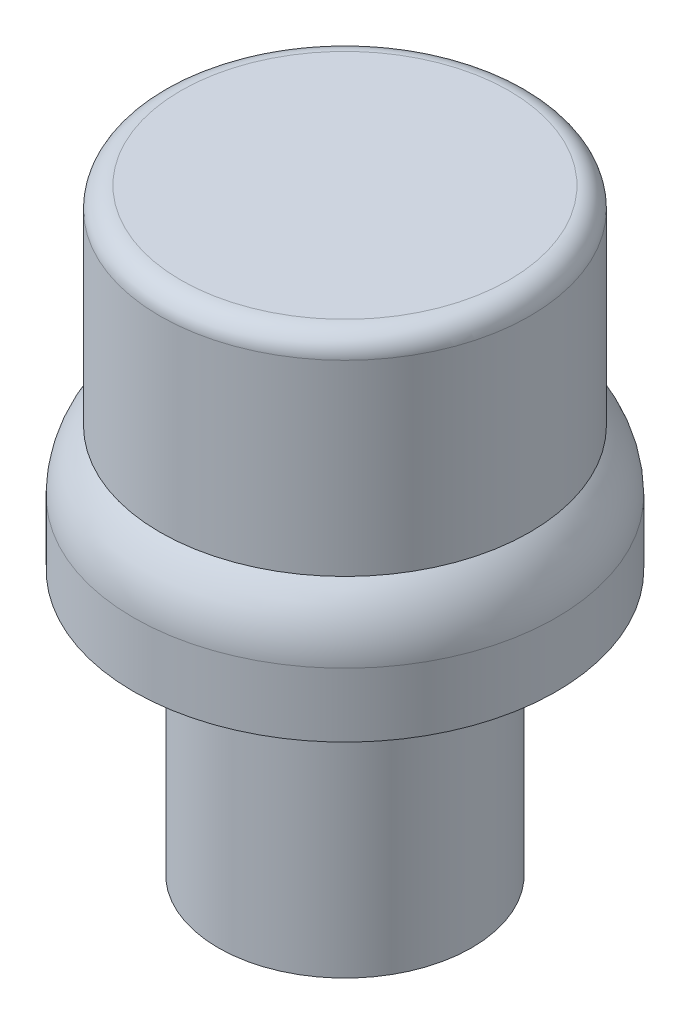
ISO-10303-21;
HEADER;
FILE_DESCRIPTION(('STEP AP214'),'2;1');
FILE_NAME('part.step','',(''),(''),'','','');
FILE_SCHEMA(('AUTOMOTIVE_DESIGN { 1 0 10303 214 1 1 1 1 }'));
ENDSEC;
DATA;
#1=APPLICATION_CONTEXT('core data for automotive mechanical design processes');
#2=APPLICATION_PROTOCOL_DEFINITION('international standard','automotive_design',2000,#1);
#3=PRODUCT_CONTEXT('',#1,'mechanical');
#4=PRODUCT('Part','Part','',(#3));
#5=PRODUCT_RELATED_PRODUCT_CATEGORY('part','',(#4));
#6=PRODUCT_DEFINITION_FORMATION('','',#4);
#7=PRODUCT_DEFINITION_CONTEXT('part definition',#1,'design');
#8=PRODUCT_DEFINITION('design','',#6,#7);
#9=PRODUCT_DEFINITION_SHAPE('','',#8);
#10=(LENGTH_UNIT() NAMED_UNIT(*) SI_UNIT(.MILLI.,.METRE.));
#11=(NAMED_UNIT(*) PLANE_ANGLE_UNIT() SI_UNIT($,.RADIAN.));
#12=(NAMED_UNIT(*) SI_UNIT($,.STERADIAN.) SOLID_ANGLE_UNIT());
#13=UNCERTAINTY_MEASURE_WITH_UNIT(LENGTH_MEASURE(1.E-05),#10,'distance_accuracy_value','');
#14=(GEOMETRIC_REPRESENTATION_CONTEXT(3) GLOBAL_UNCERTAINTY_ASSIGNED_CONTEXT((#13)) GLOBAL_UNIT_ASSIGNED_CONTEXT((#10,
#11,#12)) REPRESENTATION_CONTEXT('',''));
#15=CARTESIAN_POINT('',(0.,0.,0.));
#16=DIRECTION('',(0.,0.,1.));
#17=DIRECTION('',(1.,0.,0.));
#18=AXIS2_PLACEMENT_3D('',#15,#16,#17);
#19=CARTESIAN_POINT('',(0.,3.,0.));
#20=DIRECTION('',(0.,-1.,0.));
#21=DIRECTION('',(0.,0.,-1.));
#22=AXIS2_PLACEMENT_3D('',#19,#20,#21);
#23=CYLINDRICAL_SURFACE('',#22,5.08);
#24=CARTESIAN_POINT('',(0.,1.5382288140752,0.));
#25=DIRECTION('',(0.,1.,0.));
#26=DIRECTION('',(0.,0.,1.));
#27=AXIS2_PLACEMENT_3D('',#24,#25,#26);
#28=CIRCLE('',#27,5.08);
#29=CARTESIAN_POINT('',(0.,1.5382288140752,5.08));
#30=VERTEX_POINT('',#29);
#31=EDGE_CURVE('E119',#30,#30,#28,.F.);
#32=ORIENTED_EDGE('',*,*,#31,.T.);
#33=EDGE_LOOP('',(#32));
#34=FACE_BOUND('',#33,.T.);
#35=CARTESIAN_POINT('',(0.,0.,0.));
#36=DIRECTION('',(0.,1.,0.));
#37=DIRECTION('',(0.,0.,1.));
#38=AXIS2_PLACEMENT_3D('',#35,#36,#37);
#39=CIRCLE('',#38,5.08);
#40=CARTESIAN_POINT('',(0.,0.,5.08));
#41=VERTEX_POINT('',#40);
#42=EDGE_CURVE('E114',#41,#41,#39,.T.);
#43=ORIENTED_EDGE('',*,*,#42,.T.);
#44=EDGE_LOOP('',(#43));
#45=FACE_BOUND('',#44,.T.);
#46=ADVANCED_FACE('F33',(#34,#45),#23,.T.);
#47=CARTESIAN_POINT('',(0.,0.,0.));
#48=DIRECTION('',(0.,1.,0.));
#49=DIRECTION('',(0.,0.,1.));
#50=AXIS2_PLACEMENT_3D('',#47,#48,#49);
#51=PLANE('',#50);
#52=CARTESIAN_POINT('',(0.,0.,0.));
#53=DIRECTION('',(0.,-1.,0.));
#54=DIRECTION('',(0.,0.,-1.));
#55=AXIS2_PLACEMENT_3D('',#52,#53,#54);
#56=CIRCLE('',#55,3.048);
#57=CARTESIAN_POINT('',(0.,0.,-3.048));
#58=VERTEX_POINT('',#57);
#59=EDGE_CURVE('E11',#58,#58,#56,.T.);
#60=ORIENTED_EDGE('',*,*,#59,.F.);
#61=EDGE_LOOP('',(#60));
#62=FACE_BOUND('',#61,.T.);
#63=ORIENTED_EDGE('',*,*,#42,.F.);
#64=EDGE_LOOP('',(#63));
#65=FACE_BOUND('',#64,.T.);
#66=ADVANCED_FACE('F147',(#62,#65),#51,.F.);
#67=CARTESIAN_POINT('',(0.,8.,0.));
#68=DIRECTION('',(0.,-1.,0.));
#69=DIRECTION('',(0.,0.,-1.));
#70=AXIS2_PLACEMENT_3D('',#67,#68,#69);
#71=CYLINDRICAL_SURFACE('',#70,4.445);
#72=CARTESIAN_POINT('',(0.,7.5,0.));
#73=DIRECTION('',(0.,1.,0.));
#74=DIRECTION('',(0.,0.,1.));
#75=AXIS2_PLACEMENT_3D('',#72,#73,#74);
#76=CIRCLE('',#75,4.445);
#77=CARTESIAN_POINT('',(0.,7.5,4.445));
#78=VERTEX_POINT('',#77);
#79=EDGE_CURVE('E37',#78,#78,#76,.F.);
#80=ORIENTED_EDGE('',*,*,#79,.T.);
#81=EDGE_LOOP('',(#80));
#82=FACE_BOUND('',#81,.T.);
#83=CARTESIAN_POINT('',(0.,3.,0.));
#84=DIRECTION('',(0.,1.,0.));
#85=DIRECTION('',(0.,0.,1.));
#86=AXIS2_PLACEMENT_3D('',#83,#84,#85);
#87=CIRCLE('',#86,4.445);
#88=CARTESIAN_POINT('',(0.,3.,4.445));
#89=VERTEX_POINT('',#88);
#90=EDGE_CURVE('E116',#89,#89,#87,.T.);
#91=ORIENTED_EDGE('',*,*,#90,.T.);
#92=EDGE_LOOP('',(#91));
#93=FACE_BOUND('',#92,.T.);
#94=ADVANCED_FACE('F130',(#82,#93),#71,.T.);
#95=CARTESIAN_POINT('',(0.,8.,0.));
#96=DIRECTION('',(0.,1.,0.));
#97=DIRECTION('',(0.,0.,1.));
#98=AXIS2_PLACEMENT_3D('',#95,#96,#97);
#99=PLANE('',#98);
#100=CARTESIAN_POINT('',(0.,8.,0.));
#101=DIRECTION('',(0.,1.,0.));
#102=DIRECTION('',(0.,0.,1.));
#103=AXIS2_PLACEMENT_3D('',#100,#101,#102);
#104=CIRCLE('',#103,3.945);
#105=CARTESIAN_POINT('',(0.,8.,3.945));
#106=VERTEX_POINT('',#105);
#107=EDGE_CURVE('E123',#106,#106,#104,.T.);
#108=ORIENTED_EDGE('',*,*,#107,.T.);
#109=EDGE_LOOP('',(#108));
#110=FACE_BOUND('',#109,.T.);
#111=ADVANCED_FACE('F144',(#110),#99,.T.);
#112=CARTESIAN_POINT('',(0.,1.5382288140752,0.));
#113=DIRECTION('',(0.,1.,0.));
#114=DIRECTION('',(0.,0.,1.));
#115=AXIS2_PLACEMENT_3D('',#112,#113,#114);
#116=TOROIDAL_SURFACE('',#115,3.08,2.);
#117=ORIENTED_EDGE('',*,*,#31,.F.);
#118=EDGE_LOOP('',(#117));
#119=FACE_BOUND('',#118,.T.);
#120=ORIENTED_EDGE('',*,*,#90,.F.);
#121=EDGE_LOOP('',(#120));
#122=FACE_BOUND('',#121,.T.);
#123=ADVANCED_FACE('F136',(#119,#122),#116,.T.);
#124=CARTESIAN_POINT('',(0.,7.5,0.));
#125=DIRECTION('',(0.,1.,0.));
#126=DIRECTION('',(0.,0.,1.));
#127=AXIS2_PLACEMENT_3D('',#124,#125,#126);
#128=TOROIDAL_SURFACE('',#127,3.945,0.5);
#129=ORIENTED_EDGE('',*,*,#79,.F.);
#130=EDGE_LOOP('',(#129));
#131=FACE_BOUND('',#130,.T.);
#132=ORIENTED_EDGE('',*,*,#107,.F.);
#133=EDGE_LOOP('',(#132));
#134=FACE_BOUND('',#133,.T.);
#135=ADVANCED_FACE('F35',(#131,#134),#128,.T.);
#136=CARTESIAN_POINT('',(0.,-6.35,0.));
#137=DIRECTION('',(0.,1.,0.));
#138=DIRECTION('',(0.,0.,1.));
#139=AXIS2_PLACEMENT_3D('',#136,#137,#138);
#140=CYLINDRICAL_SURFACE('',#139,3.048);
#141=CARTESIAN_POINT('',(0.,-6.35,0.));
#142=DIRECTION('',(0.,-1.,0.));
#143=DIRECTION('',(0.,0.,-1.));
#144=AXIS2_PLACEMENT_3D('',#141,#142,#143);
#145=CIRCLE('',#144,3.048);
#146=CARTESIAN_POINT('',(0.,-6.35,-3.048));
#147=VERTEX_POINT('',#146);
#148=EDGE_CURVE('E110',#147,#147,#145,.T.);
#149=ORIENTED_EDGE('',*,*,#148,.F.);
#150=EDGE_LOOP('',(#149));
#151=FACE_BOUND('',#150,.T.);
#152=ORIENTED_EDGE('',*,*,#59,.T.);
#153=EDGE_LOOP('',(#152));
#154=FACE_BOUND('',#153,.T.);
#155=ADVANCED_FACE('F135',(#151,#154),#140,.T.);
#156=CARTESIAN_POINT('',(0.,-6.35,0.));
#157=DIRECTION('',(0.,-1.,0.));
#158=DIRECTION('',(0.,0.,-1.));
#159=AXIS2_PLACEMENT_3D('',#156,#157,#158);
#160=PLANE('',#159);
#161=DIRECTION('',(0.,0.,1.));
#162=VECTOR('',#161,1.);
#163=CARTESIAN_POINT('',(0.793692416751826,-6.35,-0.744956917477651));
#164=LINE('',#163,#162);
#165=CARTESIAN_POINT('',(0.793692416751826,-6.35,-0.744956917477651));
#166=VERTEX_POINT('',#165);
#167=CARTESIAN_POINT('',(0.793692416751826,-6.35,0.744956917477651));
#168=VERTEX_POINT('',#167);
#169=EDGE_CURVE('E49',#166,#168,#164,.T.);
#170=ORIENTED_EDGE('',*,*,#169,.F.);
#171=DIRECTION('',(1.,0.,0.));
#172=VECTOR('',#171,1.);
#173=CARTESIAN_POINT('',(-0.793692416751826,-6.35,-0.744956917477651));
#174=LINE('',#173,#172);
#175=CARTESIAN_POINT('',(-0.793692416751826,-6.35,-0.744956917477651));
#176=VERTEX_POINT('',#175);
#177=EDGE_CURVE('E100',#176,#166,#174,.T.);
#178=ORIENTED_EDGE('',*,*,#177,.F.);
#179=DIRECTION('',(0.,0.,-1.));
#180=VECTOR('',#179,1.);
#181=CARTESIAN_POINT('',(-0.793692416751826,-6.35,-0.744956917477651));
#182=LINE('',#181,#180);
#183=CARTESIAN_POINT('',(-0.793692416751826,-6.35,0.744956917477651));
#184=VERTEX_POINT('',#183);
#185=EDGE_CURVE('E106',#184,#176,#182,.T.);
#186=ORIENTED_EDGE('',*,*,#185,.F.);
#187=DIRECTION('',(-1.,0.,0.));
#188=VECTOR('',#187,1.);
#189=CARTESIAN_POINT('',(-0.793692416751826,-6.35,0.744956917477651));
#190=LINE('',#189,#188);
#191=EDGE_CURVE('E84',#168,#184,#190,.T.);
#192=ORIENTED_EDGE('',*,*,#191,.F.);
#193=EDGE_LOOP('',(#170,#178,#186,#192));
#194=FACE_BOUND('',#193,.T.);
#195=ORIENTED_EDGE('',*,*,#148,.T.);
#196=EDGE_LOOP('',(#195));
#197=FACE_BOUND('',#196,.T.);
#198=ADVANCED_FACE('F141',(#194,#197),#160,.T.);
#199=CARTESIAN_POINT('',(0.793692416751826,-5.08,-0.744956917477651));
#200=DIRECTION('',(1.,0.,0.));
#201=DIRECTION('',(0.,0.,-1.));
#202=AXIS2_PLACEMENT_3D('',#199,#200,#201);
#203=PLANE('',#202);
#204=ORIENTED_EDGE('',*,*,#169,.T.);
#205=DIRECTION('',(0.,-1.,0.));
#206=VECTOR('',#205,1.);
#207=CARTESIAN_POINT('',(0.793692416751826,-5.08,0.744956917477651));
#208=LINE('',#207,#206);
#209=CARTESIAN_POINT('',(0.793692416751826,-5.08,0.744956917477651));
#210=VERTEX_POINT('',#209);
#211=EDGE_CURVE('E72',#210,#168,#208,.T.);
#212=ORIENTED_EDGE('',*,*,#211,.F.);
#213=DIRECTION('',(0.,0.,1.));
#214=VECTOR('',#213,1.);
#215=CARTESIAN_POINT('',(0.793692416751826,-5.08,-0.744956917477651));
#216=LINE('',#215,#214);
#217=CARTESIAN_POINT('',(0.793692416751826,-5.08,-0.744956917477651));
#218=VERTEX_POINT('',#217);
#219=EDGE_CURVE('E98',#218,#210,#216,.T.);
#220=ORIENTED_EDGE('',*,*,#219,.F.);
#221=DIRECTION('',(0.,-1.,0.));
#222=VECTOR('',#221,1.);
#223=CARTESIAN_POINT('',(0.793692416751826,-5.08,-0.744956917477651));
#224=LINE('',#223,#222);
#225=EDGE_CURVE('E57',#218,#166,#224,.T.);
#226=ORIENTED_EDGE('',*,*,#225,.T.);
#227=EDGE_LOOP('',(#204,#212,#220,#226));
#228=FACE_BOUND('',#227,.T.);
#229=ADVANCED_FACE('F163',(#228),#203,.F.);
#230=CARTESIAN_POINT('',(-0.793692416751826,-5.08,-0.744956917477651));
#231=DIRECTION('',(0.,0.,-1.));
#232=DIRECTION('',(-1.,0.,0.));
#233=AXIS2_PLACEMENT_3D('',#230,#231,#232);
#234=PLANE('',#233);
#235=ORIENTED_EDGE('',*,*,#177,.T.);
#236=ORIENTED_EDGE('',*,*,#225,.F.);
#237=DIRECTION('',(1.,0.,0.));
#238=VECTOR('',#237,1.);
#239=CARTESIAN_POINT('',(-0.793692416751826,-5.08,-0.744956917477651));
#240=LINE('',#239,#238);
#241=CARTESIAN_POINT('',(-0.793692416751826,-5.08,-0.744956917477651));
#242=VERTEX_POINT('',#241);
#243=EDGE_CURVE('E95',#242,#218,#240,.T.);
#244=ORIENTED_EDGE('',*,*,#243,.F.);
#245=DIRECTION('',(0.,-1.,0.));
#246=VECTOR('',#245,1.);
#247=CARTESIAN_POINT('',(-0.793692416751826,-5.08,-0.744956917477651));
#248=LINE('',#247,#246);
#249=EDGE_CURVE('E88',#242,#176,#248,.T.);
#250=ORIENTED_EDGE('',*,*,#249,.T.);
#251=EDGE_LOOP('',(#235,#236,#244,#250));
#252=FACE_BOUND('',#251,.T.);
#253=ADVANCED_FACE('F167',(#252),#234,.F.);
#254=CARTESIAN_POINT('',(-0.793692416751826,-5.08,-0.744956917477651));
#255=DIRECTION('',(-1.,0.,0.));
#256=DIRECTION('',(0.,0.,1.));
#257=AXIS2_PLACEMENT_3D('',#254,#255,#256);
#258=PLANE('',#257);
#259=ORIENTED_EDGE('',*,*,#185,.T.);
#260=ORIENTED_EDGE('',*,*,#249,.F.);
#261=DIRECTION('',(0.,0.,-1.));
#262=VECTOR('',#261,1.);
#263=CARTESIAN_POINT('',(-0.793692416751826,-5.08,-0.744956917477651));
#264=LINE('',#263,#262);
#265=CARTESIAN_POINT('',(-0.793692416751826,-5.08,0.744956917477651));
#266=VERTEX_POINT('',#265);
#267=EDGE_CURVE('E91',#266,#242,#264,.T.);
#268=ORIENTED_EDGE('',*,*,#267,.F.);
#269=DIRECTION('',(0.,-1.,0.));
#270=VECTOR('',#269,1.);
#271=CARTESIAN_POINT('',(-0.793692416751826,-5.08,0.744956917477651));
#272=LINE('',#271,#270);
#273=EDGE_CURVE('E77',#266,#184,#272,.T.);
#274=ORIENTED_EDGE('',*,*,#273,.T.);
#275=EDGE_LOOP('',(#259,#260,#268,#274));
#276=FACE_BOUND('',#275,.T.);
#277=ADVANCED_FACE('F92',(#276),#258,.F.);
#278=CARTESIAN_POINT('',(-0.793692416751826,-5.08,0.744956917477651));
#279=DIRECTION('',(0.,0.,1.));
#280=DIRECTION('',(1.,0.,0.));
#281=AXIS2_PLACEMENT_3D('',#278,#279,#280);
#282=PLANE('',#281);
#283=ORIENTED_EDGE('',*,*,#191,.T.);
#284=ORIENTED_EDGE('',*,*,#273,.F.);
#285=DIRECTION('',(-1.,0.,0.));
#286=VECTOR('',#285,1.);
#287=CARTESIAN_POINT('',(-0.793692416751826,-5.08,0.744956917477651));
#288=LINE('',#287,#286);
#289=EDGE_CURVE('E81',#210,#266,#288,.T.);
#290=ORIENTED_EDGE('',*,*,#289,.F.);
#291=ORIENTED_EDGE('',*,*,#211,.T.);
#292=EDGE_LOOP('',(#283,#284,#290,#291));
#293=FACE_BOUND('',#292,.T.);
#294=ADVANCED_FACE('F79',(#293),#282,.F.);
#295=CARTESIAN_POINT('',(0.,-5.08,0.));
#296=DIRECTION('',(0.,1.,0.));
#297=DIRECTION('',(0.,0.,1.));
#298=AXIS2_PLACEMENT_3D('',#295,#296,#297);
#299=PLANE('',#298);
#300=ORIENTED_EDGE('',*,*,#219,.T.);
#301=ORIENTED_EDGE('',*,*,#289,.T.);
#302=ORIENTED_EDGE('',*,*,#267,.T.);
#303=ORIENTED_EDGE('',*,*,#243,.T.);
#304=EDGE_LOOP('',(#300,#301,#302,#303));
#305=FACE_BOUND('',#304,.T.);
#306=ADVANCED_FACE('F97',(#305),#299,.F.);
#307=CLOSED_SHELL('',(#46,#66,#94,#111,#123,#135,#155,#198,#229,#253,#277,#294,#306));
#308=MANIFOLD_SOLID_BREP('B2',#307);
#309=ADVANCED_BREP_SHAPE_REPRESENTATION('',(#18,#308),#14);
#310=SHAPE_DEFINITION_REPRESENTATION(#9,#309);
ENDSEC;
END-ISO-10303-21;
